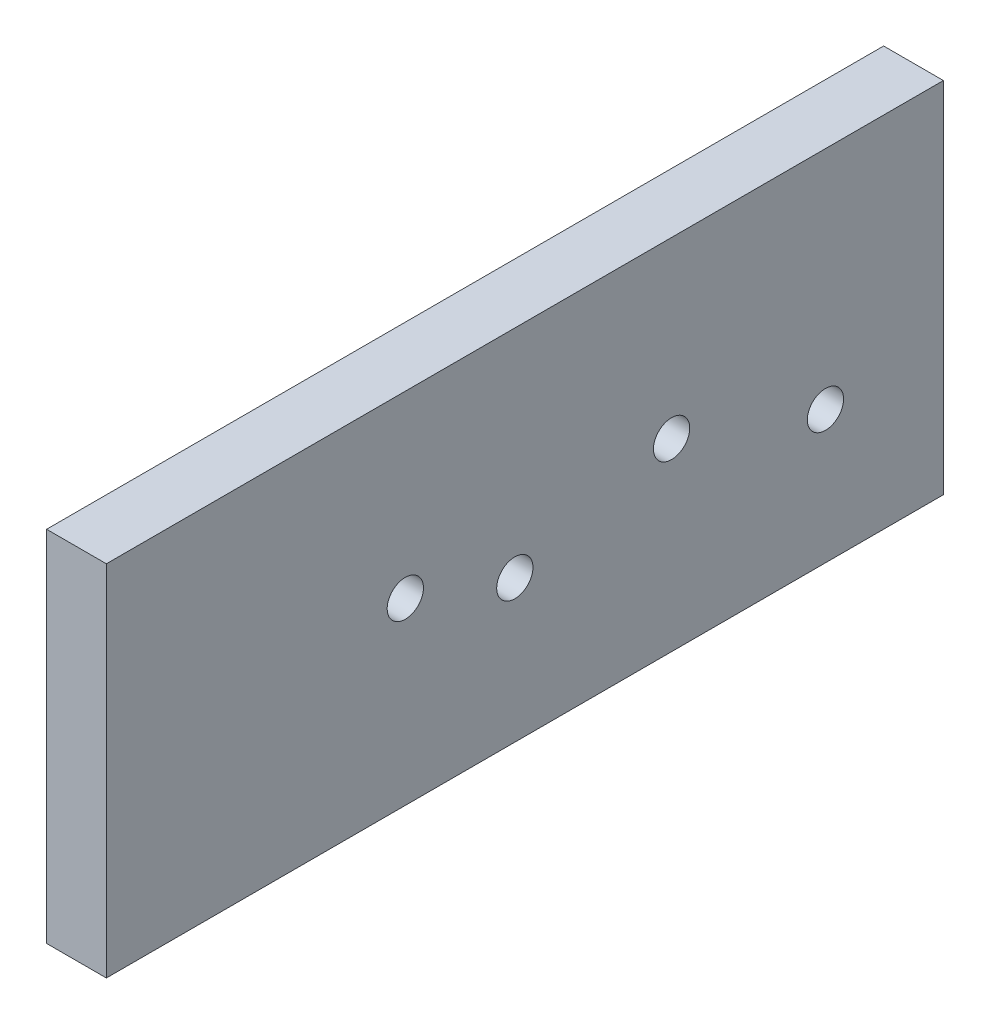
ISO-10303-21;
HEADER;
FILE_DESCRIPTION(('STEP AP214'),'2;1');
FILE_NAME('part.step','',(''),(''),'','','');
FILE_SCHEMA(('AUTOMOTIVE_DESIGN { 1 0 10303 214 1 1 1 1 }'));
ENDSEC;
DATA;
#1=APPLICATION_CONTEXT('core data for automotive mechanical design processes');
#2=APPLICATION_PROTOCOL_DEFINITION('international standard','automotive_design',2000,#1);
#3=PRODUCT_CONTEXT('',#1,'mechanical');
#4=PRODUCT('Part','Part','',(#3));
#5=PRODUCT_RELATED_PRODUCT_CATEGORY('part','',(#4));
#6=PRODUCT_DEFINITION_FORMATION('','',#4);
#7=PRODUCT_DEFINITION_CONTEXT('part definition',#1,'design');
#8=PRODUCT_DEFINITION('design','',#6,#7);
#9=PRODUCT_DEFINITION_SHAPE('','',#8);
#10=(LENGTH_UNIT() NAMED_UNIT(*) SI_UNIT(.MILLI.,.METRE.));
#11=(NAMED_UNIT(*) PLANE_ANGLE_UNIT() SI_UNIT($,.RADIAN.));
#12=(NAMED_UNIT(*) SI_UNIT($,.STERADIAN.) SOLID_ANGLE_UNIT());
#13=UNCERTAINTY_MEASURE_WITH_UNIT(LENGTH_MEASURE(1.E-05),#10,'distance_accuracy_value','');
#14=(GEOMETRIC_REPRESENTATION_CONTEXT(3) GLOBAL_UNCERTAINTY_ASSIGNED_CONTEXT((#13)) GLOBAL_UNIT_ASSIGNED_CONTEXT((#10,
#11,#12)) REPRESENTATION_CONTEXT('',''));
#15=CARTESIAN_POINT('',(0.,0.,0.));
#16=DIRECTION('',(0.,0.,1.));
#17=DIRECTION('',(1.,0.,0.));
#18=AXIS2_PLACEMENT_3D('',#15,#16,#17);
#19=CARTESIAN_POINT('',(12.7,-9.873506971,-51.1434579937716));
#20=DIRECTION('',(-1.,0.,0.));
#21=DIRECTION('',(0.,0.,1.));
#22=AXIS2_PLACEMENT_3D('',#19,#20,#21);
#23=CYLINDRICAL_SURFACE('',#22,3.85455777521835);
#24=CARTESIAN_POINT('',(12.7,-9.873506971,-51.1434579937716));
#25=DIRECTION('',(1.,0.,0.));
#26=DIRECTION('',(0.,0.,-1.));
#27=AXIS2_PLACEMENT_3D('',#24,#25,#26);
#28=CIRCLE('',#27,3.85455777521835);
#29=CARTESIAN_POINT('',(12.7,-9.873506971,-54.99801576899));
#30=VERTEX_POINT('',#29);
#31=EDGE_CURVE('E141',#30,#30,#28,.T.);
#32=ORIENTED_EDGE('',*,*,#31,.T.);
#33=EDGE_LOOP('',(#32));
#34=FACE_BOUND('',#33,.T.);
#35=CARTESIAN_POINT('',(5.08,-9.873506971,-51.1434579937716));
#36=DIRECTION('',(-1.,0.,0.));
#37=DIRECTION('',(0.,0.,1.));
#38=AXIS2_PLACEMENT_3D('',#35,#36,#37);
#39=CIRCLE('',#38,3.85455777521835);
#40=CARTESIAN_POINT('',(5.08,-9.873506971,-47.2889002185533));
#41=VERTEX_POINT('',#40);
#42=EDGE_CURVE('E47',#41,#41,#39,.T.);
#43=ORIENTED_EDGE('',*,*,#42,.T.);
#44=EDGE_LOOP('',(#43));
#45=FACE_BOUND('',#44,.T.);
#46=ADVANCED_FACE('F43',(#34,#45),#23,.F.);
#47=CARTESIAN_POINT('',(12.7,1.096077429,-18.4577335821185));
#48=DIRECTION('',(-1.,0.,0.));
#49=DIRECTION('',(0.,0.,1.));
#50=AXIS2_PLACEMENT_3D('',#47,#48,#49);
#51=CYLINDRICAL_SURFACE('',#50,3.85455777521835);
#52=CARTESIAN_POINT('',(12.7,1.096077429,-18.4577335821185));
#53=DIRECTION('',(1.,0.,0.));
#54=DIRECTION('',(0.,0.,-1.));
#55=AXIS2_PLACEMENT_3D('',#52,#53,#54);
#56=CIRCLE('',#55,3.85455777521835);
#57=CARTESIAN_POINT('',(12.7,1.096077429,-22.3122913573368));
#58=VERTEX_POINT('',#57);
#59=EDGE_CURVE('E138',#58,#58,#56,.T.);
#60=ORIENTED_EDGE('',*,*,#59,.T.);
#61=EDGE_LOOP('',(#60));
#62=FACE_BOUND('',#61,.T.);
#63=CARTESIAN_POINT('',(5.08,1.096077429,-18.4577335821185));
#64=DIRECTION('',(-1.,0.,0.));
#65=DIRECTION('',(0.,0.,1.));
#66=AXIS2_PLACEMENT_3D('',#63,#64,#65);
#67=CIRCLE('',#66,3.85455777521835);
#68=CARTESIAN_POINT('',(5.08,1.096077429,-14.6031758069001));
#69=VERTEX_POINT('',#68);
#70=EDGE_CURVE('E166',#69,#69,#67,.T.);
#71=ORIENTED_EDGE('',*,*,#70,.T.);
#72=EDGE_LOOP('',(#71));
#73=FACE_BOUND('',#72,.T.);
#74=ADVANCED_FACE('F246',(#62,#73),#51,.F.);
#75=CARTESIAN_POINT('',(12.7,0.,38.1));
#76=DIRECTION('',(-1.,0.,0.));
#77=DIRECTION('',(0.,0.,1.));
#78=AXIS2_PLACEMENT_3D('',#75,#76,#77);
#79=CYLINDRICAL_SURFACE('',#78,3.85455777521835);
#80=CARTESIAN_POINT('',(12.7,0.,38.1));
#81=DIRECTION('',(1.,0.,0.));
#82=DIRECTION('',(0.,0.,-1.));
#83=AXIS2_PLACEMENT_3D('',#80,#81,#82);
#84=CIRCLE('',#83,3.85455777521835);
#85=CARTESIAN_POINT('',(12.7,0.,34.2454422247817));
#86=VERTEX_POINT('',#85);
#87=EDGE_CURVE('E135',#86,#86,#84,.T.);
#88=ORIENTED_EDGE('',*,*,#87,.T.);
#89=EDGE_LOOP('',(#88));
#90=FACE_BOUND('',#89,.T.);
#91=CARTESIAN_POINT('',(5.08,0.,38.1));
#92=DIRECTION('',(-1.,0.,0.));
#93=DIRECTION('',(0.,0.,1.));
#94=AXIS2_PLACEMENT_3D('',#91,#92,#93);
#95=CIRCLE('',#94,3.85455777521835);
#96=CARTESIAN_POINT('',(5.08,0.,41.9545577752184));
#97=VERTEX_POINT('',#96);
#98=EDGE_CURVE('E163',#97,#97,#95,.T.);
#99=ORIENTED_EDGE('',*,*,#98,.T.);
#100=EDGE_LOOP('',(#99));
#101=FACE_BOUND('',#100,.T.);
#102=ADVANCED_FACE('F253',(#90,#101),#79,.F.);
#103=CARTESIAN_POINT('',(12.7,-7.860160654,14.8360220129459));
#104=DIRECTION('',(-1.,0.,0.));
#105=DIRECTION('',(0.,0.,1.));
#106=AXIS2_PLACEMENT_3D('',#103,#104,#105);
#107=CYLINDRICAL_SURFACE('',#106,3.85455777521835);
#108=CARTESIAN_POINT('',(12.7,-7.860160654,14.8360220129459));
#109=DIRECTION('',(1.,0.,0.));
#110=DIRECTION('',(0.,0.,-1.));
#111=AXIS2_PLACEMENT_3D('',#108,#109,#110);
#112=CIRCLE('',#111,3.85455777521835);
#113=CARTESIAN_POINT('',(12.7,-7.860160654,10.9814642377276));
#114=VERTEX_POINT('',#113);
#115=EDGE_CURVE('E144',#114,#114,#112,.T.);
#116=ORIENTED_EDGE('',*,*,#115,.T.);
#117=EDGE_LOOP('',(#116));
#118=FACE_BOUND('',#117,.T.);
#119=CARTESIAN_POINT('',(5.08,-7.860160654,14.8360220129459));
#120=DIRECTION('',(-1.,0.,0.));
#121=DIRECTION('',(0.,0.,1.));
#122=AXIS2_PLACEMENT_3D('',#119,#120,#121);
#123=CIRCLE('',#122,3.85455777521835);
#124=CARTESIAN_POINT('',(5.08,-7.860160654,18.6905797881643));
#125=VERTEX_POINT('',#124);
#126=EDGE_CURVE('E160',#125,#125,#123,.T.);
#127=ORIENTED_EDGE('',*,*,#126,.T.);
#128=EDGE_LOOP('',(#127));
#129=FACE_BOUND('',#128,.T.);
#130=ADVANCED_FACE('F243',(#118,#129),#107,.F.);
#131=CARTESIAN_POINT('',(12.7,-38.1,0.));
#132=DIRECTION('',(0.,1.,0.));
#133=DIRECTION('',(0.,0.,1.));
#134=AXIS2_PLACEMENT_3D('',#131,#132,#133);
#135=PLANE('',#134);
#136=CARTESIAN_POINT('',(6.35000000000002,-38.1,-63.5));
#137=DIRECTION('',(0.,-1.,0.));
#138=DIRECTION('',(0.,0.,-1.));
#139=AXIS2_PLACEMENT_3D('',#136,#137,#138);
#140=CIRCLE('',#139,3.17499999999999);
#141=CARTESIAN_POINT('',(6.35000000000002,-38.1,-66.675));
#142=VERTEX_POINT('',#141);
#143=EDGE_CURVE('E110',#142,#142,#140,.T.);
#144=ORIENTED_EDGE('',*,*,#143,.F.);
#145=EDGE_LOOP('',(#144));
#146=FACE_BOUND('',#145,.T.);
#147=CARTESIAN_POINT('',(6.35000000000001,-38.1,0.));
#148=DIRECTION('',(0.,-1.,0.));
#149=DIRECTION('',(0.,0.,-1.));
#150=AXIS2_PLACEMENT_3D('',#147,#148,#149);
#151=CIRCLE('',#150,3.17499999999999);
#152=CARTESIAN_POINT('',(6.35000000000001,-38.1,-3.17499999999997));
#153=VERTEX_POINT('',#152);
#154=EDGE_CURVE('E109',#153,#153,#151,.T.);
#155=ORIENTED_EDGE('',*,*,#154,.F.);
#156=EDGE_LOOP('',(#155));
#157=FACE_BOUND('',#156,.T.);
#158=CARTESIAN_POINT('',(6.35,-38.1,57.15));
#159=DIRECTION('',(0.,-1.,0.));
#160=DIRECTION('',(0.,0.,-1.));
#161=AXIS2_PLACEMENT_3D('',#158,#159,#160);
#162=CIRCLE('',#161,3.17499999999999);
#163=CARTESIAN_POINT('',(6.35,-38.1,53.975));
#164=VERTEX_POINT('',#163);
#165=EDGE_CURVE('E121',#164,#164,#162,.T.);
#166=ORIENTED_EDGE('',*,*,#165,.F.);
#167=EDGE_LOOP('',(#166));
#168=FACE_BOUND('',#167,.T.);
#169=DIRECTION('',(0.,0.,-1.));
#170=VECTOR('',#169,1.);
#171=CARTESIAN_POINT('',(0.,-38.1,0.));
#172=LINE('',#171,#170);
#173=CARTESIAN_POINT('',(0.,-38.1,101.6));
#174=VERTEX_POINT('',#173);
#175=CARTESIAN_POINT('',(0.,-38.1,-76.2));
#176=VERTEX_POINT('',#175);
#177=EDGE_CURVE('E127',#174,#176,#172,.T.);
#178=ORIENTED_EDGE('',*,*,#177,.T.);
#179=DIRECTION('',(-1.,0.,0.));
#180=VECTOR('',#179,1.);
#181=CARTESIAN_POINT('',(12.7,-38.1,-76.2));
#182=LINE('',#181,#180);
#183=CARTESIAN_POINT('',(12.7,-38.1,-76.2));
#184=VERTEX_POINT('',#183);
#185=EDGE_CURVE('E11',#184,#176,#182,.T.);
#186=ORIENTED_EDGE('',*,*,#185,.F.);
#187=DIRECTION('',(0.,0.,-1.));
#188=VECTOR('',#187,1.);
#189=CARTESIAN_POINT('',(12.7,-38.1,0.));
#190=LINE('',#189,#188);
#191=CARTESIAN_POINT('',(12.7,-38.1,101.6));
#192=VERTEX_POINT('',#191);
#193=EDGE_CURVE('E128',#192,#184,#190,.T.);
#194=ORIENTED_EDGE('',*,*,#193,.F.);
#195=DIRECTION('',(-1.,0.,0.));
#196=VECTOR('',#195,1.);
#197=CARTESIAN_POINT('',(12.7,-38.1,101.6));
#198=LINE('',#197,#196);
#199=EDGE_CURVE('E147',#192,#174,#198,.T.);
#200=ORIENTED_EDGE('',*,*,#199,.T.);
#201=EDGE_LOOP('',(#178,#186,#194,#200));
#202=FACE_BOUND('',#201,.T.);
#203=ADVANCED_FACE('F45',(#146,#157,#168,#202),#135,.F.);
#204=CARTESIAN_POINT('',(12.7,0.,-76.2));
#205=DIRECTION('',(0.,0.,1.));
#206=DIRECTION('',(1.,0.,0.));
#207=AXIS2_PLACEMENT_3D('',#204,#205,#206);
#208=PLANE('',#207);
#209=DIRECTION('',(0.,1.,0.));
#210=VECTOR('',#209,1.);
#211=CARTESIAN_POINT('',(0.,0.,-76.2));
#212=LINE('',#211,#210);
#213=CARTESIAN_POINT('',(0.,38.1,-76.2));
#214=VERTEX_POINT('',#213);
#215=EDGE_CURVE('E150',#176,#214,#212,.T.);
#216=ORIENTED_EDGE('',*,*,#215,.T.);
#217=DIRECTION('',(-1.,0.,0.));
#218=VECTOR('',#217,1.);
#219=CARTESIAN_POINT('',(12.7,38.1,-76.2));
#220=LINE('',#219,#218);
#221=CARTESIAN_POINT('',(12.7,38.1,-76.2));
#222=VERTEX_POINT('',#221);
#223=EDGE_CURVE('E53',#222,#214,#220,.T.);
#224=ORIENTED_EDGE('',*,*,#223,.F.);
#225=DIRECTION('',(0.,1.,0.));
#226=VECTOR('',#225,1.);
#227=CARTESIAN_POINT('',(12.7,0.,-76.2));
#228=LINE('',#227,#226);
#229=EDGE_CURVE('E89',#184,#222,#228,.T.);
#230=ORIENTED_EDGE('',*,*,#229,.F.);
#231=ORIENTED_EDGE('',*,*,#185,.T.);
#232=EDGE_LOOP('',(#216,#224,#230,#231));
#233=FACE_BOUND('',#232,.T.);
#234=ADVANCED_FACE('F236',(#233),#208,.F.);
#235=CARTESIAN_POINT('',(12.7,38.1,0.));
#236=DIRECTION('',(0.,1.,0.));
#237=DIRECTION('',(0.,0.,1.));
#238=AXIS2_PLACEMENT_3D('',#235,#236,#237);
#239=PLANE('',#238);
#240=DIRECTION('',(0.,0.,-1.));
#241=VECTOR('',#240,1.);
#242=CARTESIAN_POINT('',(0.,38.1,0.));
#243=LINE('',#242,#241);
#244=CARTESIAN_POINT('',(0.,38.1,101.6));
#245=VERTEX_POINT('',#244);
#246=EDGE_CURVE('E153',#245,#214,#243,.T.);
#247=ORIENTED_EDGE('',*,*,#246,.F.);
#248=DIRECTION('',(-1.,0.,0.));
#249=VECTOR('',#248,1.);
#250=CARTESIAN_POINT('',(12.7,38.1,101.6));
#251=LINE('',#250,#249);
#252=CARTESIAN_POINT('',(12.7,38.1,101.6));
#253=VERTEX_POINT('',#252);
#254=EDGE_CURVE('E79',#253,#245,#251,.T.);
#255=ORIENTED_EDGE('',*,*,#254,.F.);
#256=DIRECTION('',(0.,0.,-1.));
#257=VECTOR('',#256,1.);
#258=CARTESIAN_POINT('',(12.7,38.1,0.));
#259=LINE('',#258,#257);
#260=EDGE_CURVE('E131',#253,#222,#259,.T.);
#261=ORIENTED_EDGE('',*,*,#260,.T.);
#262=ORIENTED_EDGE('',*,*,#223,.T.);
#263=EDGE_LOOP('',(#247,#255,#261,#262));
#264=FACE_BOUND('',#263,.T.);
#265=ADVANCED_FACE('F235',(#264),#239,.T.);
#266=CARTESIAN_POINT('',(12.7,0.,101.6));
#267=DIRECTION('',(0.,0.,-1.));
#268=DIRECTION('',(-1.,0.,0.));
#269=AXIS2_PLACEMENT_3D('',#266,#267,#268);
#270=PLANE('',#269);
#271=DIRECTION('',(0.,-1.,0.));
#272=VECTOR('',#271,1.);
#273=CARTESIAN_POINT('',(0.,0.,101.6));
#274=LINE('',#273,#272);
#275=EDGE_CURVE('E82',#245,#174,#274,.T.);
#276=ORIENTED_EDGE('',*,*,#275,.T.);
#277=ORIENTED_EDGE('',*,*,#199,.F.);
#278=DIRECTION('',(0.,-1.,0.));
#279=VECTOR('',#278,1.);
#280=CARTESIAN_POINT('',(12.7,0.,101.6));
#281=LINE('',#280,#279);
#282=EDGE_CURVE('E62',#253,#192,#281,.T.);
#283=ORIENTED_EDGE('',*,*,#282,.F.);
#284=ORIENTED_EDGE('',*,*,#254,.T.);
#285=EDGE_LOOP('',(#276,#277,#283,#284));
#286=FACE_BOUND('',#285,.T.);
#287=ADVANCED_FACE('F232',(#286),#270,.F.);
#288=CARTESIAN_POINT('',(12.7,0.,0.));
#289=DIRECTION('',(1.,0.,0.));
#290=DIRECTION('',(0.,0.,-1.));
#291=AXIS2_PLACEMENT_3D('',#288,#289,#290);
#292=PLANE('',#291);
#293=ORIENTED_EDGE('',*,*,#193,.T.);
#294=ORIENTED_EDGE('',*,*,#229,.T.);
#295=ORIENTED_EDGE('',*,*,#260,.F.);
#296=ORIENTED_EDGE('',*,*,#282,.T.);
#297=EDGE_LOOP('',(#293,#294,#295,#296));
#298=FACE_BOUND('',#297,.T.);
#299=ORIENTED_EDGE('',*,*,#87,.F.);
#300=EDGE_LOOP('',(#299));
#301=FACE_BOUND('',#300,.T.);
#302=ORIENTED_EDGE('',*,*,#59,.F.);
#303=EDGE_LOOP('',(#302));
#304=FACE_BOUND('',#303,.T.);
#305=ORIENTED_EDGE('',*,*,#31,.F.);
#306=EDGE_LOOP('',(#305));
#307=FACE_BOUND('',#306,.T.);
#308=ORIENTED_EDGE('',*,*,#115,.F.);
#309=EDGE_LOOP('',(#308));
#310=FACE_BOUND('',#309,.T.);
#311=ADVANCED_FACE('F219',(#298,#301,#304,#307,#310),#292,.T.);
#312=CARTESIAN_POINT('',(0.,0.,0.));
#313=DIRECTION('',(1.,0.,0.));
#314=DIRECTION('',(0.,0.,-1.));
#315=AXIS2_PLACEMENT_3D('',#312,#313,#314);
#316=PLANE('',#315);
#317=CARTESIAN_POINT('',(0.,0.,38.1));
#318=DIRECTION('',(-1.,0.,0.));
#319=DIRECTION('',(0.,0.,1.));
#320=AXIS2_PLACEMENT_3D('',#317,#318,#319);
#321=CIRCLE('',#320,7.9375);
#322=CARTESIAN_POINT('',(0.,0.,46.0375));
#323=VERTEX_POINT('',#322);
#324=EDGE_CURVE('E200',#323,#323,#321,.T.);
#325=ORIENTED_EDGE('',*,*,#324,.F.);
#326=EDGE_LOOP('',(#325));
#327=FACE_BOUND('',#326,.T.);
#328=CARTESIAN_POINT('',(0.,-7.860160654,14.8360220129459));
#329=DIRECTION('',(-1.,0.,0.));
#330=DIRECTION('',(0.,0.,1.));
#331=AXIS2_PLACEMENT_3D('',#328,#329,#330);
#332=CIRCLE('',#331,7.9375);
#333=CARTESIAN_POINT('',(0.,-7.860160654,22.7735220129459));
#334=VERTEX_POINT('',#333);
#335=EDGE_CURVE('E197',#334,#334,#332,.T.);
#336=ORIENTED_EDGE('',*,*,#335,.F.);
#337=EDGE_LOOP('',(#336));
#338=FACE_BOUND('',#337,.T.);
#339=CARTESIAN_POINT('',(0.,1.096077429,-18.4577335821185));
#340=DIRECTION('',(-1.,0.,0.));
#341=DIRECTION('',(0.,0.,1.));
#342=AXIS2_PLACEMENT_3D('',#339,#340,#341);
#343=CIRCLE('',#342,7.9375);
#344=CARTESIAN_POINT('',(0.,1.096077429,-10.5202335821185));
#345=VERTEX_POINT('',#344);
#346=EDGE_CURVE('E191',#345,#345,#343,.T.);
#347=ORIENTED_EDGE('',*,*,#346,.F.);
#348=EDGE_LOOP('',(#347));
#349=FACE_BOUND('',#348,.T.);
#350=CARTESIAN_POINT('',(0.,-9.873506971,-51.1434579937716));
#351=DIRECTION('',(-1.,0.,0.));
#352=DIRECTION('',(0.,0.,1.));
#353=AXIS2_PLACEMENT_3D('',#350,#351,#352);
#354=CIRCLE('',#353,7.9375);
#355=CARTESIAN_POINT('',(0.,-9.873506971,-43.2059579937716));
#356=VERTEX_POINT('',#355);
#357=EDGE_CURVE('E184',#356,#356,#354,.T.);
#358=ORIENTED_EDGE('',*,*,#357,.F.);
#359=EDGE_LOOP('',(#358));
#360=FACE_BOUND('',#359,.T.);
#361=ORIENTED_EDGE('',*,*,#177,.F.);
#362=ORIENTED_EDGE('',*,*,#275,.F.);
#363=ORIENTED_EDGE('',*,*,#246,.T.);
#364=ORIENTED_EDGE('',*,*,#215,.F.);
#365=EDGE_LOOP('',(#361,#362,#363,#364));
#366=FACE_BOUND('',#365,.T.);
#367=ADVANCED_FACE('F215',(#327,#338,#349,#360,#366),#316,.F.);
#368=CARTESIAN_POINT('',(6.35,0.,57.15));
#369=DIRECTION('',(0.,-1.,0.));
#370=DIRECTION('',(0.,0.,-1.));
#371=AXIS2_PLACEMENT_3D('',#368,#369,#370);
#372=CONICAL_SURFACE('',#371,3.17499999999999,1.02974425867665);
#373=CARTESIAN_POINT('',(6.34999999999999,1.9077324654125,57.15));
#374=VERTEX_POINT('',#373);
#375=VERTEX_LOOP('',#374);
#376=FACE_BOUND('',#375,.T.);
#377=CARTESIAN_POINT('',(6.35,0.,57.15));
#378=DIRECTION('',(0.,-1.,0.));
#379=DIRECTION('',(0.,0.,-1.));
#380=AXIS2_PLACEMENT_3D('',#377,#378,#379);
#381=CIRCLE('',#380,3.17499999999999);
#382=CARTESIAN_POINT('',(6.35,0.,53.975));
#383=VERTEX_POINT('',#382);
#384=EDGE_CURVE('E124',#383,#383,#381,.T.);
#385=ORIENTED_EDGE('',*,*,#384,.T.);
#386=EDGE_LOOP('',(#385));
#387=FACE_BOUND('',#386,.T.);
#388=ADVANCED_FACE('F218',(#376,#387),#372,.F.);
#389=CARTESIAN_POINT('',(6.35,-38.1,57.15));
#390=DIRECTION('',(0.,-1.,0.));
#391=DIRECTION('',(0.,0.,-1.));
#392=AXIS2_PLACEMENT_3D('',#389,#390,#391);
#393=CYLINDRICAL_SURFACE('',#392,3.17499999999999);
#394=ORIENTED_EDGE('',*,*,#384,.F.);
#395=EDGE_LOOP('',(#394));
#396=FACE_BOUND('',#395,.T.);
#397=ORIENTED_EDGE('',*,*,#165,.T.);
#398=EDGE_LOOP('',(#397));
#399=FACE_BOUND('',#398,.T.);
#400=ADVANCED_FACE('F271',(#396,#399),#393,.F.);
#401=CARTESIAN_POINT('',(6.35000000000001,0.,0.));
#402=DIRECTION('',(0.,-1.,0.));
#403=DIRECTION('',(0.,0.,-1.));
#404=AXIS2_PLACEMENT_3D('',#401,#402,#403);
#405=CONICAL_SURFACE('',#404,3.17499999999999,1.02974425867665);
#406=CARTESIAN_POINT('',(6.35,1.9077324654125,0.));
#407=VERTEX_POINT('',#406);
#408=VERTEX_LOOP('',#407);
#409=FACE_BOUND('',#408,.T.);
#410=CARTESIAN_POINT('',(6.35000000000001,0.,0.));
#411=DIRECTION('',(0.,-1.,0.));
#412=DIRECTION('',(0.,0.,-1.));
#413=AXIS2_PLACEMENT_3D('',#410,#411,#412);
#414=CIRCLE('',#413,3.17499999999999);
#415=CARTESIAN_POINT('',(6.35000000000001,0.,-3.17499999999998));
#416=VERTEX_POINT('',#415);
#417=EDGE_CURVE('E113',#416,#416,#414,.T.);
#418=ORIENTED_EDGE('',*,*,#417,.T.);
#419=EDGE_LOOP('',(#418));
#420=FACE_BOUND('',#419,.T.);
#421=ADVANCED_FACE('F275',(#409,#420),#405,.F.);
#422=CARTESIAN_POINT('',(6.35000000000001,-38.1,0.));
#423=DIRECTION('',(0.,-1.,0.));
#424=DIRECTION('',(0.,0.,-1.));
#425=AXIS2_PLACEMENT_3D('',#422,#423,#424);
#426=CYLINDRICAL_SURFACE('',#425,3.17499999999999);
#427=ORIENTED_EDGE('',*,*,#417,.F.);
#428=EDGE_LOOP('',(#427));
#429=FACE_BOUND('',#428,.T.);
#430=ORIENTED_EDGE('',*,*,#154,.T.);
#431=EDGE_LOOP('',(#430));
#432=FACE_BOUND('',#431,.T.);
#433=ADVANCED_FACE('F103',(#429,#432),#426,.F.);
#434=CARTESIAN_POINT('',(6.35000000000002,0.,-63.5));
#435=DIRECTION('',(0.,-1.,0.));
#436=DIRECTION('',(0.,0.,-1.));
#437=AXIS2_PLACEMENT_3D('',#434,#435,#436);
#438=CONICAL_SURFACE('',#437,3.17499999999999,1.02974425867665);
#439=CARTESIAN_POINT('',(6.35000000000001,1.9077324654125,-63.5));
#440=VERTEX_POINT('',#439);
#441=VERTEX_LOOP('',#440);
#442=FACE_BOUND('',#441,.T.);
#443=CARTESIAN_POINT('',(6.35000000000002,0.,-63.5));
#444=DIRECTION('',(0.,-1.,0.));
#445=DIRECTION('',(0.,0.,-1.));
#446=AXIS2_PLACEMENT_3D('',#443,#444,#445);
#447=CIRCLE('',#446,3.17499999999999);
#448=CARTESIAN_POINT('',(6.35000000000002,0.,-66.675));
#449=VERTEX_POINT('',#448);
#450=EDGE_CURVE('E107',#449,#449,#447,.T.);
#451=ORIENTED_EDGE('',*,*,#450,.T.);
#452=EDGE_LOOP('',(#451));
#453=FACE_BOUND('',#452,.T.);
#454=ADVANCED_FACE('F99',(#442,#453),#438,.F.);
#455=CARTESIAN_POINT('',(6.35000000000002,-38.1,-63.5));
#456=DIRECTION('',(0.,-1.,0.));
#457=DIRECTION('',(0.,0.,-1.));
#458=AXIS2_PLACEMENT_3D('',#455,#456,#457);
#459=CYLINDRICAL_SURFACE('',#458,3.17499999999999);
#460=ORIENTED_EDGE('',*,*,#450,.F.);
#461=EDGE_LOOP('',(#460));
#462=FACE_BOUND('',#461,.T.);
#463=ORIENTED_EDGE('',*,*,#143,.T.);
#464=EDGE_LOOP('',(#463));
#465=FACE_BOUND('',#464,.T.);
#466=ADVANCED_FACE('F102',(#462,#465),#459,.F.);
#467=CARTESIAN_POINT('',(5.08,-9.873506971,-51.1434579937716));
#468=DIRECTION('',(-1.,0.,0.));
#469=DIRECTION('',(0.,0.,1.));
#470=AXIS2_PLACEMENT_3D('',#467,#468,#469);
#471=CYLINDRICAL_SURFACE('',#470,7.9375);
#472=CARTESIAN_POINT('',(5.08,-9.873506971,-51.1434579937716));
#473=DIRECTION('',(-1.,0.,0.));
#474=DIRECTION('',(0.,0.,1.));
#475=AXIS2_PLACEMENT_3D('',#472,#473,#474);
#476=CIRCLE('',#475,7.9375);
#477=CARTESIAN_POINT('',(5.08,-9.873506971,-43.2059579937716));
#478=VERTEX_POINT('',#477);
#479=EDGE_CURVE('E182',#478,#478,#476,.T.);
#480=ORIENTED_EDGE('',*,*,#479,.F.);
#481=EDGE_LOOP('',(#480));
#482=FACE_BOUND('',#481,.T.);
#483=ORIENTED_EDGE('',*,*,#357,.T.);
#484=EDGE_LOOP('',(#483));
#485=FACE_BOUND('',#484,.T.);
#486=ADVANCED_FACE('F178',(#482,#485),#471,.F.);
#487=CARTESIAN_POINT('',(5.08,-9.873506971,-51.1434579937716));
#488=DIRECTION('',(-1.,0.,0.));
#489=DIRECTION('',(0.,0.,1.));
#490=AXIS2_PLACEMENT_3D('',#487,#488,#489);
#491=PLANE('',#490);
#492=ORIENTED_EDGE('',*,*,#42,.F.);
#493=EDGE_LOOP('',(#492));
#494=FACE_BOUND('',#493,.T.);
#495=ORIENTED_EDGE('',*,*,#479,.T.);
#496=EDGE_LOOP('',(#495));
#497=FACE_BOUND('',#496,.T.);
#498=ADVANCED_FACE('F174',(#494,#497),#491,.T.);
#499=CARTESIAN_POINT('',(5.08,1.096077429,-18.4577335821185));
#500=DIRECTION('',(-1.,0.,0.));
#501=DIRECTION('',(0.,0.,1.));
#502=AXIS2_PLACEMENT_3D('',#499,#500,#501);
#503=CYLINDRICAL_SURFACE('',#502,7.9375);
#504=CARTESIAN_POINT('',(5.08,1.096077429,-18.4577335821185));
#505=DIRECTION('',(-1.,0.,0.));
#506=DIRECTION('',(0.,0.,1.));
#507=AXIS2_PLACEMENT_3D('',#504,#505,#506);
#508=CIRCLE('',#507,7.9375);
#509=CARTESIAN_POINT('',(5.08,1.096077429,-10.5202335821185));
#510=VERTEX_POINT('',#509);
#511=EDGE_CURVE('E186',#510,#510,#508,.T.);
#512=ORIENTED_EDGE('',*,*,#511,.F.);
#513=EDGE_LOOP('',(#512));
#514=FACE_BOUND('',#513,.T.);
#515=ORIENTED_EDGE('',*,*,#346,.T.);
#516=EDGE_LOOP('',(#515));
#517=FACE_BOUND('',#516,.T.);
#518=ADVANCED_FACE('F177',(#514,#517),#503,.F.);
#519=CARTESIAN_POINT('',(5.08,1.096077429,-18.4577335821185));
#520=DIRECTION('',(-1.,0.,0.));
#521=DIRECTION('',(0.,0.,1.));
#522=AXIS2_PLACEMENT_3D('',#519,#520,#521);
#523=PLANE('',#522);
#524=ORIENTED_EDGE('',*,*,#70,.F.);
#525=EDGE_LOOP('',(#524));
#526=FACE_BOUND('',#525,.T.);
#527=ORIENTED_EDGE('',*,*,#511,.T.);
#528=EDGE_LOOP('',(#527));
#529=FACE_BOUND('',#528,.T.);
#530=ADVANCED_FACE('F286',(#526,#529),#523,.T.);
#531=CARTESIAN_POINT('',(5.08,-7.860160654,14.8360220129459));
#532=DIRECTION('',(-1.,0.,0.));
#533=DIRECTION('',(0.,0.,1.));
#534=AXIS2_PLACEMENT_3D('',#531,#532,#533);
#535=CYLINDRICAL_SURFACE('',#534,7.9375);
#536=CARTESIAN_POINT('',(5.08,-7.860160654,14.8360220129459));
#537=DIRECTION('',(-1.,0.,0.));
#538=DIRECTION('',(0.,0.,1.));
#539=AXIS2_PLACEMENT_3D('',#536,#537,#538);
#540=CIRCLE('',#539,7.9375);
#541=CARTESIAN_POINT('',(5.08,-7.860160654,22.7735220129459));
#542=VERTEX_POINT('',#541);
#543=EDGE_CURVE('E194',#542,#542,#540,.T.);
#544=ORIENTED_EDGE('',*,*,#543,.F.);
#545=EDGE_LOOP('',(#544));
#546=FACE_BOUND('',#545,.T.);
#547=ORIENTED_EDGE('',*,*,#335,.T.);
#548=EDGE_LOOP('',(#547));
#549=FACE_BOUND('',#548,.T.);
#550=ADVANCED_FACE('F289',(#546,#549),#535,.F.);
#551=CARTESIAN_POINT('',(5.08,-7.860160654,14.8360220129459));
#552=DIRECTION('',(-1.,0.,0.));
#553=DIRECTION('',(0.,0.,1.));
#554=AXIS2_PLACEMENT_3D('',#551,#552,#553);
#555=PLANE('',#554);
#556=ORIENTED_EDGE('',*,*,#126,.F.);
#557=EDGE_LOOP('',(#556));
#558=FACE_BOUND('',#557,.T.);
#559=ORIENTED_EDGE('',*,*,#543,.T.);
#560=EDGE_LOOP('',(#559));
#561=FACE_BOUND('',#560,.T.);
#562=ADVANCED_FACE('F211',(#558,#561),#555,.T.);
#563=CARTESIAN_POINT('',(5.08,0.,38.1));
#564=DIRECTION('',(-1.,0.,0.));
#565=DIRECTION('',(0.,0.,1.));
#566=AXIS2_PLACEMENT_3D('',#563,#564,#565);
#567=CYLINDRICAL_SURFACE('',#566,7.9375);
#568=CARTESIAN_POINT('',(5.08,0.,38.1));
#569=DIRECTION('',(-1.,0.,0.));
#570=DIRECTION('',(0.,0.,1.));
#571=AXIS2_PLACEMENT_3D('',#568,#569,#570);
#572=CIRCLE('',#571,7.9375);
#573=CARTESIAN_POINT('',(5.08,0.,46.0375));
#574=VERTEX_POINT('',#573);
#575=EDGE_CURVE('E164',#574,#574,#572,.T.);
#576=ORIENTED_EDGE('',*,*,#575,.F.);
#577=EDGE_LOOP('',(#576));
#578=FACE_BOUND('',#577,.T.);
#579=ORIENTED_EDGE('',*,*,#324,.T.);
#580=EDGE_LOOP('',(#579));
#581=FACE_BOUND('',#580,.T.);
#582=ADVANCED_FACE('F208',(#578,#581),#567,.F.);
#583=CARTESIAN_POINT('',(5.08,0.,38.1));
#584=DIRECTION('',(-1.,0.,0.));
#585=DIRECTION('',(0.,0.,1.));
#586=AXIS2_PLACEMENT_3D('',#583,#584,#585);
#587=PLANE('',#586);
#588=ORIENTED_EDGE('',*,*,#98,.F.);
#589=EDGE_LOOP('',(#588));
#590=FACE_BOUND('',#589,.T.);
#591=ORIENTED_EDGE('',*,*,#575,.T.);
#592=EDGE_LOOP('',(#591));
#593=FACE_BOUND('',#592,.T.);
#594=ADVANCED_FACE('F206',(#590,#593),#587,.T.);
#595=CLOSED_SHELL('',(#46,#74,#102,#130,#203,#234,#265,#287,#311,#367,#388,#400,#421,#433,#454,
#466,#486,#498,#518,#530,#550,#562,#582,#594));
#596=MANIFOLD_SOLID_BREP('B2',#595);
#597=ADVANCED_BREP_SHAPE_REPRESENTATION('',(#18,#596),#14);
#598=SHAPE_DEFINITION_REPRESENTATION(#9,#597);
ENDSEC;
END-ISO-10303-21;
